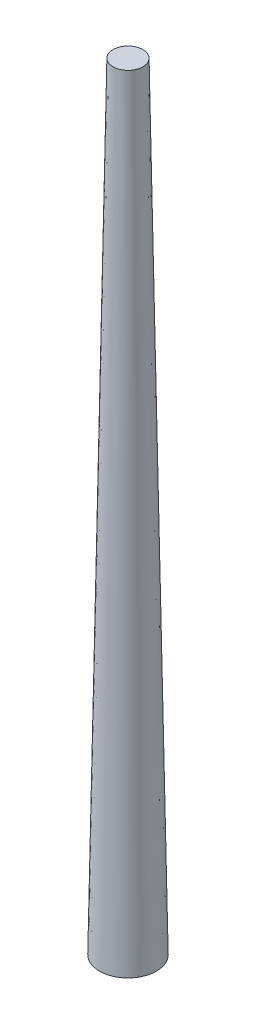
ISO-10303-21;
HEADER;
FILE_DESCRIPTION(('STEP AP214'),'2;1');
FILE_NAME('part.step','',(''),(''),'','','');
FILE_SCHEMA(('AUTOMOTIVE_DESIGN { 1 0 10303 214 1 1 1 1 }'));
ENDSEC;
DATA;
#1=APPLICATION_CONTEXT('core data for automotive mechanical design processes');
#2=APPLICATION_PROTOCOL_DEFINITION('international standard','automotive_design',2000,#1);
#3=PRODUCT_CONTEXT('',#1,'mechanical');
#4=PRODUCT('Part','Part','',(#3));
#5=PRODUCT_RELATED_PRODUCT_CATEGORY('part','',(#4));
#6=PRODUCT_DEFINITION_FORMATION('','',#4);
#7=PRODUCT_DEFINITION_CONTEXT('part definition',#1,'design');
#8=PRODUCT_DEFINITION('design','',#6,#7);
#9=PRODUCT_DEFINITION_SHAPE('','',#8);
#10=(LENGTH_UNIT() NAMED_UNIT(*) SI_UNIT(.MILLI.,.METRE.));
#11=(NAMED_UNIT(*) PLANE_ANGLE_UNIT() SI_UNIT($,.RADIAN.));
#12=(NAMED_UNIT(*) SI_UNIT($,.STERADIAN.) SOLID_ANGLE_UNIT());
#13=UNCERTAINTY_MEASURE_WITH_UNIT(LENGTH_MEASURE(1.E-05),#10,'distance_accuracy_value','');
#14=(GEOMETRIC_REPRESENTATION_CONTEXT(3) GLOBAL_UNCERTAINTY_ASSIGNED_CONTEXT((#13)) GLOBAL_UNIT_ASSIGNED_CONTEXT((#10,
#11,#12)) REPRESENTATION_CONTEXT('',''));
#15=CARTESIAN_POINT('',(0.,0.,0.));
#16=DIRECTION('',(0.,0.,1.));
#17=DIRECTION('',(1.,0.,0.));
#18=AXIS2_PLACEMENT_3D('',#15,#16,#17);
#19=CARTESIAN_POINT('',(0.,78.,0.));
#20=DIRECTION('',(0.,-1.,0.));
#21=DIRECTION('',(1.,0.,0.));
#22=AXIS2_PLACEMENT_3D('',#19,#20,#21);
#23=PLANE('',#22);
#24=CARTESIAN_POINT('',(0.,78.,0.));
#25=DIRECTION('',(0.,1.,0.));
#26=DIRECTION('',(-1.,0.,0.));
#27=AXIS2_PLACEMENT_3D('',#24,#25,#26);
#28=CIRCLE('',#27,1.5);
#29=CARTESIAN_POINT('',(-1.5,78.,0.));
#30=VERTEX_POINT('',#29);
#31=EDGE_CURVE('E10',#30,#30,#28,.T.);
#32=ORIENTED_EDGE('',*,*,#31,.T.);
#33=EDGE_LOOP('',(#32));
#34=FACE_BOUND('',#33,.T.);
#35=ADVANCED_FACE('F35',(#34),#23,.F.);
#36=CARTESIAN_POINT('',(0.,0.,0.));
#37=DIRECTION('',(0.,-1.,0.));
#38=DIRECTION('',(1.,0.,0.));
#39=AXIS2_PLACEMENT_3D('',#36,#37,#38);
#40=CONICAL_SURFACE('',#39,2.86149506440042,0.0174532925199362);
#41=ORIENTED_EDGE('',*,*,#31,.F.);
#42=EDGE_LOOP('',(#41));
#43=FACE_BOUND('',#42,.T.);
#44=CARTESIAN_POINT('',(0.,0.,0.));
#45=DIRECTION('',(0.,1.,0.));
#46=DIRECTION('',(-1.,0.,0.));
#47=AXIS2_PLACEMENT_3D('',#44,#45,#46);
#48=CIRCLE('',#47,2.86149506440042);
#49=CARTESIAN_POINT('',(-2.86149506440042,0.,0.));
#50=VERTEX_POINT('',#49);
#51=EDGE_CURVE('E41',#50,#50,#48,.T.);
#52=ORIENTED_EDGE('',*,*,#51,.T.);
#53=EDGE_LOOP('',(#52));
#54=FACE_BOUND('',#53,.T.);
#55=ADVANCED_FACE('F47',(#43,#54),#40,.T.);
#56=CARTESIAN_POINT('',(0.,0.,0.));
#57=DIRECTION('',(0.,1.,0.));
#58=DIRECTION('',(-1.,0.,0.));
#59=AXIS2_PLACEMENT_3D('',#56,#57,#58);
#60=PLANE('',#59);
#61=ORIENTED_EDGE('',*,*,#51,.F.);
#62=EDGE_LOOP('',(#61));
#63=FACE_BOUND('',#62,.T.);
#64=ADVANCED_FACE('F49',(#63),#60,.F.);
#65=CLOSED_SHELL('',(#35,#55,#64));
#66=MANIFOLD_SOLID_BREP('B2',#65);
#67=ADVANCED_BREP_SHAPE_REPRESENTATION('',(#18,#66),#14);
#68=SHAPE_DEFINITION_REPRESENTATION(#9,#67);
ENDSEC;
END-ISO-10303-21;
